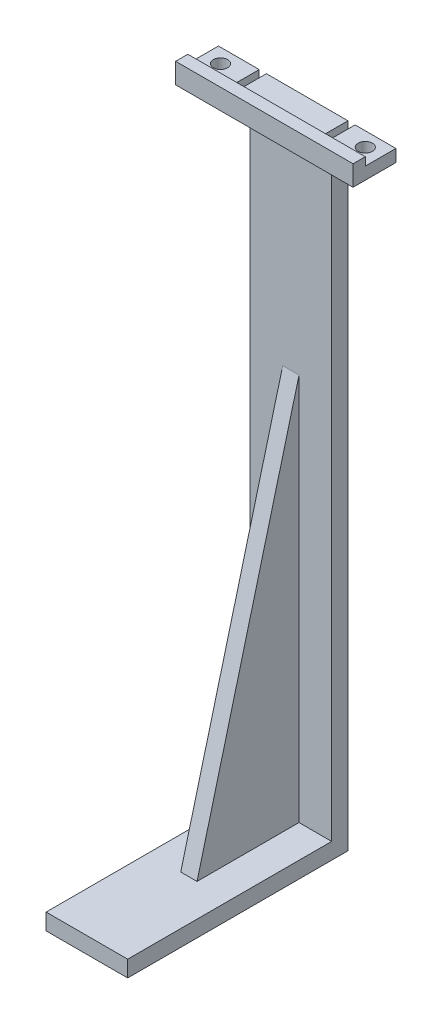
ISO-10303-21;
HEADER;
FILE_DESCRIPTION(('STEP AP214'),'2;1');
FILE_NAME('part.step','',(''),(''),'','','');
FILE_SCHEMA(('AUTOMOTIVE_DESIGN { 1 0 10303 214 1 1 1 1 }'));
ENDSEC;
DATA;
#1=APPLICATION_CONTEXT('core data for automotive mechanical design processes');
#2=APPLICATION_PROTOCOL_DEFINITION('international standard','automotive_design',2000,#1);
#3=PRODUCT_CONTEXT('',#1,'mechanical');
#4=PRODUCT('Part','Part','',(#3));
#5=PRODUCT_RELATED_PRODUCT_CATEGORY('part','',(#4));
#6=PRODUCT_DEFINITION_FORMATION('','',#4);
#7=PRODUCT_DEFINITION_CONTEXT('part definition',#1,'design');
#8=PRODUCT_DEFINITION('design','',#6,#7);
#9=PRODUCT_DEFINITION_SHAPE('','',#8);
#10=(LENGTH_UNIT() NAMED_UNIT(*) SI_UNIT(.MILLI.,.METRE.));
#11=(NAMED_UNIT(*) PLANE_ANGLE_UNIT() SI_UNIT($,.RADIAN.));
#12=(NAMED_UNIT(*) SI_UNIT($,.STERADIAN.) SOLID_ANGLE_UNIT());
#13=UNCERTAINTY_MEASURE_WITH_UNIT(LENGTH_MEASURE(1.E-05),#10,'distance_accuracy_value','');
#14=(GEOMETRIC_REPRESENTATION_CONTEXT(3) GLOBAL_UNCERTAINTY_ASSIGNED_CONTEXT((#13)) GLOBAL_UNIT_ASSIGNED_CONTEXT((#10,
#11,#12)) REPRESENTATION_CONTEXT('',''));
#15=CARTESIAN_POINT('',(0.,0.,0.));
#16=DIRECTION('',(0.,0.,1.));
#17=DIRECTION('',(1.,0.,0.));
#18=AXIS2_PLACEMENT_3D('',#15,#16,#17);
#19=CARTESIAN_POINT('',(0.,0.,7.5));
#20=DIRECTION('',(0.,0.,1.));
#21=DIRECTION('',(1.,0.,0.));
#22=AXIS2_PLACEMENT_3D('',#19,#20,#21);
#23=PLANE('',#22);
#24=DIRECTION('',(0.,1.,0.));
#25=VECTOR('',#24,1.);
#26=CARTESIAN_POINT('',(11.75,74.5,7.5));
#27=LINE('',#26,#25);
#28=CARTESIAN_POINT('',(11.75,74.5,7.5));
#29=VERTEX_POINT('',#28);
#30=CARTESIAN_POINT('',(11.75,77.5,7.5));
#31=VERTEX_POINT('',#30);
#32=EDGE_CURVE('E202',#29,#31,#27,.T.);
#33=ORIENTED_EDGE('',*,*,#32,.F.);
#34=DIRECTION('',(1.,0.,0.));
#35=VECTOR('',#34,1.);
#36=CARTESIAN_POINT('',(0.,74.5,7.5));
#37=LINE('',#36,#35);
#38=CARTESIAN_POINT('',(9.99999999999999,74.5,7.5));
#39=VERTEX_POINT('',#38);
#40=EDGE_CURVE('E251',#39,#29,#37,.T.);
#41=ORIENTED_EDGE('',*,*,#40,.F.);
#42=DIRECTION('',(0.,1.,0.));
#43=VECTOR('',#42,1.);
#44=CARTESIAN_POINT('',(9.99999999999999,77.5,7.5));
#45=LINE('',#44,#43);
#46=CARTESIAN_POINT('',(9.99999999999999,77.5,7.5));
#47=VERTEX_POINT('',#46);
#48=EDGE_CURVE('E262',#39,#47,#45,.T.);
#49=ORIENTED_EDGE('',*,*,#48,.T.);
#50=DIRECTION('',(-1.,0.,0.));
#51=VECTOR('',#50,1.);
#52=CARTESIAN_POINT('',(9.99999999999999,77.5,7.5));
#53=LINE('',#52,#51);
#54=CARTESIAN_POINT('',(-10.,77.5,7.5));
#55=VERTEX_POINT('',#54);
#56=EDGE_CURVE('E265',#47,#55,#53,.T.);
#57=ORIENTED_EDGE('',*,*,#56,.T.);
#58=DIRECTION('',(0.,-1.,0.));
#59=VECTOR('',#58,1.);
#60=CARTESIAN_POINT('',(-10.,77.5,7.5));
#61=LINE('',#60,#59);
#62=CARTESIAN_POINT('',(-10.,74.5,7.5));
#63=VERTEX_POINT('',#62);
#64=EDGE_CURVE('E268',#55,#63,#61,.T.);
#65=ORIENTED_EDGE('',*,*,#64,.T.);
#66=CARTESIAN_POINT('',(-11.75,74.5,7.5));
#67=VERTEX_POINT('',#66);
#68=EDGE_CURVE('E252',#67,#63,#37,.T.);
#69=ORIENTED_EDGE('',*,*,#68,.F.);
#70=DIRECTION('',(0.,-1.,0.));
#71=VECTOR('',#70,1.);
#72=CARTESIAN_POINT('',(-11.75,74.5,7.5));
#73=LINE('',#72,#71);
#74=CARTESIAN_POINT('',(-11.75,77.5,7.5));
#75=VERTEX_POINT('',#74);
#76=EDGE_CURVE('E221',#75,#67,#73,.T.);
#77=ORIENTED_EDGE('',*,*,#76,.F.);
#78=DIRECTION('',(1.,0.,0.));
#79=VECTOR('',#78,1.);
#80=CARTESIAN_POINT('',(-21.75,77.5,7.5));
#81=LINE('',#80,#79);
#82=CARTESIAN_POINT('',(-21.75,77.5,7.5));
#83=VERTEX_POINT('',#82);
#84=EDGE_CURVE('E216',#83,#75,#81,.T.);
#85=ORIENTED_EDGE('',*,*,#84,.F.);
#86=DIRECTION('',(0.,-1.,0.));
#87=VECTOR('',#86,1.);
#88=CARTESIAN_POINT('',(-21.75,79.5,7.5));
#89=LINE('',#88,#87);
#90=CARTESIAN_POINT('',(-21.75,79.5,7.5));
#91=VERTEX_POINT('',#90);
#92=EDGE_CURVE('E238',#91,#83,#89,.T.);
#93=ORIENTED_EDGE('',*,*,#92,.F.);
#94=DIRECTION('',(-1.,0.,0.));
#95=VECTOR('',#94,1.);
#96=CARTESIAN_POINT('',(-21.75,79.5,7.5));
#97=LINE('',#96,#95);
#98=CARTESIAN_POINT('',(21.75,79.5,7.5));
#99=VERTEX_POINT('',#98);
#100=EDGE_CURVE('E243',#99,#91,#97,.T.);
#101=ORIENTED_EDGE('',*,*,#100,.F.);
#102=DIRECTION('',(0.,1.,0.));
#103=VECTOR('',#102,1.);
#104=CARTESIAN_POINT('',(21.75,79.5,7.5));
#105=LINE('',#104,#103);
#106=CARTESIAN_POINT('',(21.75,77.5,7.5));
#107=VERTEX_POINT('',#106);
#108=EDGE_CURVE('E254',#107,#99,#105,.T.);
#109=ORIENTED_EDGE('',*,*,#108,.F.);
#110=DIRECTION('',(1.,0.,0.));
#111=VECTOR('',#110,1.);
#112=CARTESIAN_POINT('',(21.75,77.5,7.5));
#113=LINE('',#112,#111);
#114=EDGE_CURVE('E200',#31,#107,#113,.T.);
#115=ORIENTED_EDGE('',*,*,#114,.F.);
#116=EDGE_LOOP('',(#33,#41,#49,#57,#65,#69,#77,#85,#93,#101,#109,#115));
#117=FACE_BOUND('',#116,.T.);
#118=ADVANCED_FACE('F35',(#117),#23,.F.);
#119=CARTESIAN_POINT('',(0.,0.,4.));
#120=DIRECTION('',(0.,0.,-1.));
#121=DIRECTION('',(-1.,0.,0.));
#122=AXIS2_PLACEMENT_3D('',#119,#120,#121);
#123=PLANE('',#122);
#124=DIRECTION('',(1.,0.,0.));
#125=VECTOR('',#124,1.);
#126=CARTESIAN_POINT('',(9.99999999999999,74.5,4.));
#127=LINE('',#126,#125);
#128=CARTESIAN_POINT('',(-10.,74.5,4.));
#129=VERTEX_POINT('',#128);
#130=CARTESIAN_POINT('',(9.99999999999999,74.5,4.));
#131=VERTEX_POINT('',#130);
#132=EDGE_CURVE('E58',#129,#131,#127,.T.);
#133=ORIENTED_EDGE('',*,*,#132,.F.);
#134=DIRECTION('',(0.,-1.,0.));
#135=VECTOR('',#134,1.);
#136=CARTESIAN_POINT('',(-10.,77.5,4.));
#137=LINE('',#136,#135);
#138=CARTESIAN_POINT('',(-9.99999999999999,-73.5,4.));
#139=VERTEX_POINT('',#138);
#140=EDGE_CURVE('E314',#129,#139,#137,.T.);
#141=ORIENTED_EDGE('',*,*,#140,.T.);
#142=DIRECTION('',(1.,0.,0.));
#143=VECTOR('',#142,1.);
#144=CARTESIAN_POINT('',(-9.99999999999999,-73.5,4.));
#145=LINE('',#144,#143);
#146=CARTESIAN_POINT('',(-2.,-73.5,4.));
#147=VERTEX_POINT('',#146);
#148=EDGE_CURVE('E297',#139,#147,#145,.T.);
#149=ORIENTED_EDGE('',*,*,#148,.T.);
#150=DIRECTION('',(0.,-1.,0.));
#151=VECTOR('',#150,1.);
#152=CARTESIAN_POINT('',(-2.,0.,4.));
#153=LINE('',#152,#151);
#154=CARTESIAN_POINT('',(-2.,21.5000000000001,3.99999999999999));
#155=VERTEX_POINT('',#154);
#156=EDGE_CURVE('E282',#155,#147,#153,.T.);
#157=ORIENTED_EDGE('',*,*,#156,.F.);
#158=DIRECTION('',(-1.,0.,0.));
#159=VECTOR('',#158,1.);
#160=CARTESIAN_POINT('',(0.,21.5,4.));
#161=LINE('',#160,#159);
#162=CARTESIAN_POINT('',(2.,21.5000000000001,3.99999999999999));
#163=VERTEX_POINT('',#162);
#164=EDGE_CURVE('E289',#155,#163,#161,.F.);
#165=ORIENTED_EDGE('',*,*,#164,.T.);
#166=DIRECTION('',(0.,-1.,0.));
#167=VECTOR('',#166,1.);
#168=CARTESIAN_POINT('',(2.,0.,4.));
#169=LINE('',#168,#167);
#170=CARTESIAN_POINT('',(2.,-73.5,4.));
#171=VERTEX_POINT('',#170);
#172=EDGE_CURVE('E286',#163,#171,#169,.T.);
#173=ORIENTED_EDGE('',*,*,#172,.T.);
#174=CARTESIAN_POINT('',(10.,-73.5,4.));
#175=VERTEX_POINT('',#174);
#176=EDGE_CURVE('E292',#171,#175,#145,.T.);
#177=ORIENTED_EDGE('',*,*,#176,.T.);
#178=DIRECTION('',(0.,1.,0.));
#179=VECTOR('',#178,1.);
#180=CARTESIAN_POINT('',(9.99999999999999,77.5,4.));
#181=LINE('',#180,#179);
#182=EDGE_CURVE('E316',#175,#131,#181,.T.);
#183=ORIENTED_EDGE('',*,*,#182,.T.);
#184=EDGE_LOOP('',(#133,#141,#149,#157,#165,#173,#177,#183));
#185=FACE_BOUND('',#184,.T.);
#186=ADVANCED_FACE('F353',(#185),#123,.F.);
#187=CARTESIAN_POINT('',(-10.,77.5,4.));
#188=DIRECTION('',(1.,0.,0.));
#189=DIRECTION('',(0.,1.,0.));
#190=AXIS2_PLACEMENT_3D('',#187,#188,#189);
#191=PLANE('',#190);
#192=DIRECTION('',(0.,-1.,0.));
#193=VECTOR('',#192,1.);
#194=CARTESIAN_POINT('',(-10.,77.5,0.));
#195=LINE('',#194,#193);
#196=CARTESIAN_POINT('',(-10.,77.5,0.));
#197=VERTEX_POINT('',#196);
#198=CARTESIAN_POINT('',(-9.99999999999999,-77.5,0.));
#199=VERTEX_POINT('',#198);
#200=EDGE_CURVE('E311',#197,#199,#195,.T.);
#201=ORIENTED_EDGE('',*,*,#200,.T.);
#202=DIRECTION('',(0.,0.,-1.));
#203=VECTOR('',#202,1.);
#204=CARTESIAN_POINT('',(-9.99999999999999,-77.5,4.));
#205=LINE('',#204,#203);
#206=CARTESIAN_POINT('',(-9.99999999999999,-77.5,54.));
#207=VERTEX_POINT('',#206);
#208=EDGE_CURVE('E335',#207,#199,#205,.T.);
#209=ORIENTED_EDGE('',*,*,#208,.F.);
#210=DIRECTION('',(0.,1.,0.));
#211=VECTOR('',#210,1.);
#212=CARTESIAN_POINT('',(-9.99999999999999,-77.5,54.));
#213=LINE('',#212,#211);
#214=CARTESIAN_POINT('',(-9.99999999999999,-73.5,54.));
#215=VERTEX_POINT('',#214);
#216=EDGE_CURVE('E293',#207,#215,#213,.T.);
#217=ORIENTED_EDGE('',*,*,#216,.T.);
#218=DIRECTION('',(0.,0.,-1.));
#219=VECTOR('',#218,1.);
#220=CARTESIAN_POINT('',(-9.99999999999999,-73.5,54.));
#221=LINE('',#220,#219);
#222=EDGE_CURVE('E305',#215,#139,#221,.T.);
#223=ORIENTED_EDGE('',*,*,#222,.T.);
#224=ORIENTED_EDGE('',*,*,#140,.F.);
#225=DIRECTION('',(0.,0.,-1.));
#226=VECTOR('',#225,1.);
#227=CARTESIAN_POINT('',(-10.,74.5,7.5));
#228=LINE('',#227,#226);
#229=EDGE_CURVE('E275',#63,#129,#228,.T.);
#230=ORIENTED_EDGE('',*,*,#229,.F.);
#231=ORIENTED_EDGE('',*,*,#64,.F.);
#232=DIRECTION('',(0.,0.,-1.));
#233=VECTOR('',#232,1.);
#234=CARTESIAN_POINT('',(-10.,77.5,4.));
#235=LINE('',#234,#233);
#236=EDGE_CURVE('E319',#55,#197,#235,.T.);
#237=ORIENTED_EDGE('',*,*,#236,.T.);
#238=EDGE_LOOP('',(#201,#209,#217,#223,#224,#230,#231,#237));
#239=FACE_BOUND('',#238,.T.);
#240=ADVANCED_FACE('F37',(#239),#191,.F.);
#241=CARTESIAN_POINT('',(10.,-77.5,4.));
#242=DIRECTION('',(0.,1.,0.));
#243=DIRECTION('',(0.,0.,1.));
#244=AXIS2_PLACEMENT_3D('',#241,#242,#243);
#245=PLANE('',#244);
#246=DIRECTION('',(1.,0.,0.));
#247=VECTOR('',#246,1.);
#248=CARTESIAN_POINT('',(10.,-77.5,0.));
#249=LINE('',#248,#247);
#250=CARTESIAN_POINT('',(10.,-77.5,0.));
#251=VERTEX_POINT('',#250);
#252=EDGE_CURVE('E322',#199,#251,#249,.T.);
#253=ORIENTED_EDGE('',*,*,#252,.T.);
#254=DIRECTION('',(0.,0.,-1.));
#255=VECTOR('',#254,1.);
#256=CARTESIAN_POINT('',(10.,-77.5,4.));
#257=LINE('',#256,#255);
#258=CARTESIAN_POINT('',(10.,-77.5,54.));
#259=VERTEX_POINT('',#258);
#260=EDGE_CURVE('E332',#259,#251,#257,.T.);
#261=ORIENTED_EDGE('',*,*,#260,.F.);
#262=DIRECTION('',(1.,0.,0.));
#263=VECTOR('',#262,1.);
#264=CARTESIAN_POINT('',(-9.99999999999999,-77.5,54.));
#265=LINE('',#264,#263);
#266=EDGE_CURVE('E302',#207,#259,#265,.T.);
#267=ORIENTED_EDGE('',*,*,#266,.F.);
#268=ORIENTED_EDGE('',*,*,#208,.T.);
#269=EDGE_LOOP('',(#253,#261,#267,#268));
#270=FACE_BOUND('',#269,.T.);
#271=ADVANCED_FACE('F416',(#270),#245,.F.);
#272=CARTESIAN_POINT('',(9.99999999999999,77.5,4.));
#273=DIRECTION('',(-1.,0.,0.));
#274=DIRECTION('',(0.,-1.,0.));
#275=AXIS2_PLACEMENT_3D('',#272,#273,#274);
#276=PLANE('',#275);
#277=DIRECTION('',(0.,1.,0.));
#278=VECTOR('',#277,1.);
#279=CARTESIAN_POINT('',(9.99999999999999,77.5,0.));
#280=LINE('',#279,#278);
#281=CARTESIAN_POINT('',(9.99999999999999,77.5,0.));
#282=VERTEX_POINT('',#281);
#283=EDGE_CURVE('E324',#251,#282,#280,.T.);
#284=ORIENTED_EDGE('',*,*,#283,.T.);
#285=DIRECTION('',(0.,0.,-1.));
#286=VECTOR('',#285,1.);
#287=CARTESIAN_POINT('',(9.99999999999999,77.5,4.));
#288=LINE('',#287,#286);
#289=EDGE_CURVE('E329',#47,#282,#288,.T.);
#290=ORIENTED_EDGE('',*,*,#289,.F.);
#291=ORIENTED_EDGE('',*,*,#48,.F.);
#292=DIRECTION('',(0.,0.,-1.));
#293=VECTOR('',#292,1.);
#294=CARTESIAN_POINT('',(9.99999999999999,74.5,7.5));
#295=LINE('',#294,#293);
#296=EDGE_CURVE('E271',#39,#131,#295,.T.);
#297=ORIENTED_EDGE('',*,*,#296,.T.);
#298=ORIENTED_EDGE('',*,*,#182,.F.);
#299=DIRECTION('',(0.,0.,-1.));
#300=VECTOR('',#299,1.);
#301=CARTESIAN_POINT('',(10.,-73.5,54.));
#302=LINE('',#301,#300);
#303=CARTESIAN_POINT('',(10.,-73.5,54.));
#304=VERTEX_POINT('',#303);
#305=EDGE_CURVE('E308',#304,#175,#302,.T.);
#306=ORIENTED_EDGE('',*,*,#305,.F.);
#307=DIRECTION('',(0.,1.,0.));
#308=VECTOR('',#307,1.);
#309=CARTESIAN_POINT('',(10.,-77.5,54.));
#310=LINE('',#309,#308);
#311=EDGE_CURVE('E300',#259,#304,#310,.T.);
#312=ORIENTED_EDGE('',*,*,#311,.F.);
#313=ORIENTED_EDGE('',*,*,#260,.T.);
#314=EDGE_LOOP('',(#284,#290,#291,#297,#298,#306,#312,#313));
#315=FACE_BOUND('',#314,.T.);
#316=ADVANCED_FACE('F367',(#315),#276,.F.);
#317=CARTESIAN_POINT('',(9.99999999999999,77.5,4.));
#318=DIRECTION('',(0.,-1.,0.));
#319=DIRECTION('',(0.,0.,-1.));
#320=AXIS2_PLACEMENT_3D('',#317,#318,#319);
#321=PLANE('',#320);
#322=DIRECTION('',(-1.,0.,0.));
#323=VECTOR('',#322,1.);
#324=CARTESIAN_POINT('',(9.99999999999999,77.5,0.));
#325=LINE('',#324,#323);
#326=EDGE_CURVE('E317',#282,#197,#325,.T.);
#327=ORIENTED_EDGE('',*,*,#326,.T.);
#328=ORIENTED_EDGE('',*,*,#236,.F.);
#329=ORIENTED_EDGE('',*,*,#56,.F.);
#330=ORIENTED_EDGE('',*,*,#289,.T.);
#331=EDGE_LOOP('',(#327,#328,#329,#330));
#332=FACE_BOUND('',#331,.T.);
#333=ADVANCED_FACE('F409',(#332),#321,.F.);
#334=CARTESIAN_POINT('',(0.,0.,0.));
#335=DIRECTION('',(0.,0.,-1.));
#336=DIRECTION('',(-1.,0.,0.));
#337=AXIS2_PLACEMENT_3D('',#334,#335,#336);
#338=PLANE('',#337);
#339=ORIENTED_EDGE('',*,*,#283,.F.);
#340=ORIENTED_EDGE('',*,*,#252,.F.);
#341=ORIENTED_EDGE('',*,*,#200,.F.);
#342=ORIENTED_EDGE('',*,*,#326,.F.);
#343=EDGE_LOOP('',(#339,#340,#341,#342));
#344=FACE_BOUND('',#343,.T.);
#345=ADVANCED_FACE('F414',(#344),#338,.T.);
#346=CARTESIAN_POINT('',(-9.99999999999999,-73.5,54.));
#347=DIRECTION('',(0.,1.,0.));
#348=DIRECTION('',(0.,0.,1.));
#349=AXIS2_PLACEMENT_3D('',#346,#347,#348);
#350=PLANE('',#349);
#351=DIRECTION('',(0.,0.,-1.));
#352=VECTOR('',#351,1.);
#353=CARTESIAN_POINT('',(2.,-73.5,54.));
#354=LINE('',#353,#352);
#355=CARTESIAN_POINT('',(2.,-73.5,29.));
#356=VERTEX_POINT('',#355);
#357=EDGE_CURVE('E11',#356,#171,#354,.T.);
#358=ORIENTED_EDGE('',*,*,#357,.F.);
#359=DIRECTION('',(-1.,0.,0.));
#360=VECTOR('',#359,1.);
#361=CARTESIAN_POINT('',(-9.99999999999999,-73.5,29.));
#362=LINE('',#361,#360);
#363=CARTESIAN_POINT('',(-2.,-73.5,29.));
#364=VERTEX_POINT('',#363);
#365=EDGE_CURVE('E43',#364,#356,#362,.F.);
#366=ORIENTED_EDGE('',*,*,#365,.F.);
#367=DIRECTION('',(0.,0.,-1.));
#368=VECTOR('',#367,1.);
#369=CARTESIAN_POINT('',(-2.,-73.5,54.));
#370=LINE('',#369,#368);
#371=EDGE_CURVE('E338',#364,#147,#370,.T.);
#372=ORIENTED_EDGE('',*,*,#371,.T.);
#373=ORIENTED_EDGE('',*,*,#148,.F.);
#374=ORIENTED_EDGE('',*,*,#222,.F.);
#375=DIRECTION('',(1.,0.,0.));
#376=VECTOR('',#375,1.);
#377=CARTESIAN_POINT('',(-9.99999999999999,-73.5,54.));
#378=LINE('',#377,#376);
#379=EDGE_CURVE('E296',#215,#304,#378,.T.);
#380=ORIENTED_EDGE('',*,*,#379,.T.);
#381=ORIENTED_EDGE('',*,*,#305,.T.);
#382=ORIENTED_EDGE('',*,*,#176,.F.);
#383=EDGE_LOOP('',(#358,#366,#372,#373,#374,#380,#381,#382));
#384=FACE_BOUND('',#383,.T.);
#385=ADVANCED_FACE('F350',(#384),#350,.T.);
#386=CARTESIAN_POINT('',(0.,0.,54.));
#387=DIRECTION('',(0.,0.,-1.));
#388=DIRECTION('',(-1.,0.,0.));
#389=AXIS2_PLACEMENT_3D('',#386,#387,#388);
#390=PLANE('',#389);
#391=ORIENTED_EDGE('',*,*,#216,.F.);
#392=ORIENTED_EDGE('',*,*,#266,.T.);
#393=ORIENTED_EDGE('',*,*,#311,.T.);
#394=ORIENTED_EDGE('',*,*,#379,.F.);
#395=EDGE_LOOP('',(#391,#392,#393,#394));
#396=FACE_BOUND('',#395,.T.);
#397=ADVANCED_FACE('F363',(#396),#390,.F.);
#398=CARTESIAN_POINT('',(0.,-73.5,29.));
#399=DIRECTION('',(0.,-0.254493299279644,-0.967074537262647));
#400=DIRECTION('',(0.,0.967074537262646,-0.254493299279644));
#401=AXIS2_PLACEMENT_3D('',#398,#399,#400);
#402=PLANE('',#401);
#403=ORIENTED_EDGE('',*,*,#164,.F.);
#404=DIRECTION('',(0.,0.967074537262646,-0.254493299279644));
#405=VECTOR('',#404,1.);
#406=CARTESIAN_POINT('',(-2.,-73.5,29.));
#407=LINE('',#406,#405);
#408=EDGE_CURVE('E278',#364,#155,#407,.T.);
#409=ORIENTED_EDGE('',*,*,#408,.F.);
#410=ORIENTED_EDGE('',*,*,#365,.T.);
#411=DIRECTION('',(0.,0.967074537262646,-0.254493299279644));
#412=VECTOR('',#411,1.);
#413=CARTESIAN_POINT('',(2.,-73.5,29.));
#414=LINE('',#413,#412);
#415=EDGE_CURVE('E279',#356,#163,#414,.T.);
#416=ORIENTED_EDGE('',*,*,#415,.T.);
#417=EDGE_LOOP('',(#403,#409,#410,#416));
#418=FACE_BOUND('',#417,.T.);
#419=ADVANCED_FACE('F344',(#418),#402,.F.);
#420=CARTESIAN_POINT('',(2.,0.,27.));
#421=DIRECTION('',(1.,0.,0.));
#422=DIRECTION('',(0.,0.,-1.));
#423=AXIS2_PLACEMENT_3D('',#420,#421,#422);
#424=PLANE('',#423);
#425=ORIENTED_EDGE('',*,*,#172,.F.);
#426=ORIENTED_EDGE('',*,*,#415,.F.);
#427=ORIENTED_EDGE('',*,*,#357,.T.);
#428=EDGE_LOOP('',(#425,#426,#427));
#429=FACE_BOUND('',#428,.T.);
#430=ADVANCED_FACE('F348',(#429),#424,.T.);
#431=CARTESIAN_POINT('',(-2.,0.,27.));
#432=DIRECTION('',(1.,0.,0.));
#433=DIRECTION('',(0.,0.,-1.));
#434=AXIS2_PLACEMENT_3D('',#431,#432,#433);
#435=PLANE('',#434);
#436=ORIENTED_EDGE('',*,*,#408,.T.);
#437=ORIENTED_EDGE('',*,*,#156,.T.);
#438=ORIENTED_EDGE('',*,*,#371,.F.);
#439=EDGE_LOOP('',(#436,#437,#438));
#440=FACE_BOUND('',#439,.T.);
#441=ADVANCED_FACE('F356',(#440),#435,.F.);
#442=CARTESIAN_POINT('',(9.99999999999999,74.5,7.5));
#443=DIRECTION('',(0.,1.,0.));
#444=DIRECTION('',(0.,0.,1.));
#445=AXIS2_PLACEMENT_3D('',#442,#443,#444);
#446=PLANE('',#445);
#447=CARTESIAN_POINT('',(-17.75,74.5,3.5));
#448=DIRECTION('',(0.,1.,0.));
#449=DIRECTION('',(0.,0.,1.));
#450=AXIS2_PLACEMENT_3D('',#447,#448,#449);
#451=CIRCLE('',#450,1.75);
#452=CARTESIAN_POINT('',(-17.75,74.5,5.25));
#453=VERTEX_POINT('',#452);
#454=EDGE_CURVE('E205',#453,#453,#451,.T.);
#455=ORIENTED_EDGE('',*,*,#454,.T.);
#456=EDGE_LOOP('',(#455));
#457=FACE_BOUND('',#456,.T.);
#458=CARTESIAN_POINT('',(17.75,74.5,3.5));
#459=DIRECTION('',(0.,1.,0.));
#460=DIRECTION('',(0.,0.,1.));
#461=AXIS2_PLACEMENT_3D('',#458,#459,#460);
#462=CIRCLE('',#461,1.75000000000001);
#463=CARTESIAN_POINT('',(17.75,74.5,5.25000000000001));
#464=VERTEX_POINT('',#463);
#465=EDGE_CURVE('E664',#464,#464,#462,.T.);
#466=ORIENTED_EDGE('',*,*,#465,.T.);
#467=EDGE_LOOP('',(#466));
#468=FACE_BOUND('',#467,.T.);
#469=ORIENTED_EDGE('',*,*,#132,.T.);
#470=ORIENTED_EDGE('',*,*,#296,.F.);
#471=ORIENTED_EDGE('',*,*,#40,.T.);
#472=DIRECTION('',(0.,0.,1.));
#473=VECTOR('',#472,1.);
#474=CARTESIAN_POINT('',(11.75,74.5,0.));
#475=LINE('',#474,#473);
#476=CARTESIAN_POINT('',(11.75,74.5,0.));
#477=VERTEX_POINT('',#476);
#478=EDGE_CURVE('E192',#477,#29,#475,.T.);
#479=ORIENTED_EDGE('',*,*,#478,.F.);
#480=DIRECTION('',(-1.,0.,0.));
#481=VECTOR('',#480,1.);
#482=CARTESIAN_POINT('',(21.75,74.5,0.));
#483=LINE('',#482,#481);
#484=CARTESIAN_POINT('',(21.75,74.5,0.));
#485=VERTEX_POINT('',#484);
#486=EDGE_CURVE('E189',#485,#477,#483,.T.);
#487=ORIENTED_EDGE('',*,*,#486,.F.);
#488=DIRECTION('',(0.,0.,-1.));
#489=VECTOR('',#488,1.);
#490=CARTESIAN_POINT('',(21.75,74.5,10.5));
#491=LINE('',#490,#489);
#492=CARTESIAN_POINT('',(21.75,74.5,10.5));
#493=VERTEX_POINT('',#492);
#494=EDGE_CURVE('E177',#493,#485,#491,.T.);
#495=ORIENTED_EDGE('',*,*,#494,.F.);
#496=DIRECTION('',(1.,0.,0.));
#497=VECTOR('',#496,1.);
#498=CARTESIAN_POINT('',(-21.75,74.5,10.5));
#499=LINE('',#498,#497);
#500=CARTESIAN_POINT('',(-21.75,74.5,10.5));
#501=VERTEX_POINT('',#500);
#502=EDGE_CURVE('E242',#501,#493,#499,.T.);
#503=ORIENTED_EDGE('',*,*,#502,.F.);
#504=DIRECTION('',(0.,0.,-1.));
#505=VECTOR('',#504,1.);
#506=CARTESIAN_POINT('',(-21.75,74.5,10.5));
#507=LINE('',#506,#505);
#508=CARTESIAN_POINT('',(-21.75,74.5,0.));
#509=VERTEX_POINT('',#508);
#510=EDGE_CURVE('E185',#501,#509,#507,.T.);
#511=ORIENTED_EDGE('',*,*,#510,.T.);
#512=DIRECTION('',(-1.,0.,0.));
#513=VECTOR('',#512,1.);
#514=CARTESIAN_POINT('',(-21.75,74.5,0.));
#515=LINE('',#514,#513);
#516=CARTESIAN_POINT('',(-11.75,74.5,0.));
#517=VERTEX_POINT('',#516);
#518=EDGE_CURVE('E225',#517,#509,#515,.T.);
#519=ORIENTED_EDGE('',*,*,#518,.F.);
#520=DIRECTION('',(0.,0.,1.));
#521=VECTOR('',#520,1.);
#522=CARTESIAN_POINT('',(-11.75,74.5,0.));
#523=LINE('',#522,#521);
#524=EDGE_CURVE('E228',#517,#67,#523,.T.);
#525=ORIENTED_EDGE('',*,*,#524,.T.);
#526=ORIENTED_EDGE('',*,*,#68,.T.);
#527=ORIENTED_EDGE('',*,*,#229,.T.);
#528=EDGE_LOOP('',(#469,#470,#471,#479,#487,#495,#503,#511,#519,#525,#526,#527));
#529=FACE_BOUND('',#528,.T.);
#530=ADVANCED_FACE('F190',(#457,#468,#529),#446,.F.);
#531=CARTESIAN_POINT('',(-21.75,79.5,10.5));
#532=DIRECTION('',(1.,0.,0.));
#533=DIRECTION('',(0.,0.,-1.));
#534=AXIS2_PLACEMENT_3D('',#531,#532,#533);
#535=PLANE('',#534);
#536=ORIENTED_EDGE('',*,*,#92,.T.);
#537=DIRECTION('',(0.,0.,1.));
#538=VECTOR('',#537,1.);
#539=CARTESIAN_POINT('',(-21.75,77.5,0.));
#540=LINE('',#539,#538);
#541=CARTESIAN_POINT('',(-21.75,77.5,0.));
#542=VERTEX_POINT('',#541);
#543=EDGE_CURVE('E236',#542,#83,#540,.T.);
#544=ORIENTED_EDGE('',*,*,#543,.F.);
#545=DIRECTION('',(0.,1.,0.));
#546=VECTOR('',#545,1.);
#547=CARTESIAN_POINT('',(-21.75,74.5,0.));
#548=LINE('',#547,#546);
#549=EDGE_CURVE('E217',#509,#542,#548,.T.);
#550=ORIENTED_EDGE('',*,*,#549,.F.);
#551=ORIENTED_EDGE('',*,*,#510,.F.);
#552=DIRECTION('',(0.,-1.,0.));
#553=VECTOR('',#552,1.);
#554=CARTESIAN_POINT('',(-21.75,79.5,10.5));
#555=LINE('',#554,#553);
#556=CARTESIAN_POINT('',(-21.75,79.5,10.5));
#557=VERTEX_POINT('',#556);
#558=EDGE_CURVE('E239',#557,#501,#555,.T.);
#559=ORIENTED_EDGE('',*,*,#558,.F.);
#560=DIRECTION('',(0.,0.,-1.));
#561=VECTOR('',#560,1.);
#562=CARTESIAN_POINT('',(-21.75,79.5,10.5));
#563=LINE('',#562,#561);
#564=EDGE_CURVE('E248',#557,#91,#563,.T.);
#565=ORIENTED_EDGE('',*,*,#564,.T.);
#566=EDGE_LOOP('',(#536,#544,#550,#551,#559,#565));
#567=FACE_BOUND('',#566,.T.);
#568=ADVANCED_FACE('F397',(#567),#535,.F.);
#569=CARTESIAN_POINT('',(21.75,79.5,10.5));
#570=DIRECTION('',(-1.,0.,0.));
#571=DIRECTION('',(0.,0.,1.));
#572=AXIS2_PLACEMENT_3D('',#569,#570,#571);
#573=PLANE('',#572);
#574=ORIENTED_EDGE('',*,*,#494,.T.);
#575=DIRECTION('',(0.,-1.,0.));
#576=VECTOR('',#575,1.);
#577=CARTESIAN_POINT('',(21.75,74.5,0.));
#578=LINE('',#577,#576);
#579=CARTESIAN_POINT('',(21.75,77.5,0.));
#580=VERTEX_POINT('',#579);
#581=EDGE_CURVE('E181',#580,#485,#578,.T.);
#582=ORIENTED_EDGE('',*,*,#581,.F.);
#583=DIRECTION('',(0.,0.,1.));
#584=VECTOR('',#583,1.);
#585=CARTESIAN_POINT('',(21.75,77.5,0.));
#586=LINE('',#585,#584);
#587=EDGE_CURVE('E50',#580,#107,#586,.T.);
#588=ORIENTED_EDGE('',*,*,#587,.T.);
#589=ORIENTED_EDGE('',*,*,#108,.T.);
#590=DIRECTION('',(0.,0.,-1.));
#591=VECTOR('',#590,1.);
#592=CARTESIAN_POINT('',(21.75,79.5,10.5));
#593=LINE('',#592,#591);
#594=CARTESIAN_POINT('',(21.75,79.5,10.5));
#595=VERTEX_POINT('',#594);
#596=EDGE_CURVE('E186',#595,#99,#593,.T.);
#597=ORIENTED_EDGE('',*,*,#596,.F.);
#598=DIRECTION('',(0.,1.,0.));
#599=VECTOR('',#598,1.);
#600=CARTESIAN_POINT('',(21.75,79.5,10.5));
#601=LINE('',#600,#599);
#602=EDGE_CURVE('E183',#493,#595,#601,.T.);
#603=ORIENTED_EDGE('',*,*,#602,.F.);
#604=EDGE_LOOP('',(#574,#582,#588,#589,#597,#603));
#605=FACE_BOUND('',#604,.T.);
#606=ADVANCED_FACE('F179',(#605),#573,.F.);
#607=CARTESIAN_POINT('',(-21.75,79.5,10.5));
#608=DIRECTION('',(0.,-1.,0.));
#609=DIRECTION('',(1.,0.,0.));
#610=AXIS2_PLACEMENT_3D('',#607,#608,#609);
#611=PLANE('',#610);
#612=ORIENTED_EDGE('',*,*,#100,.T.);
#613=ORIENTED_EDGE('',*,*,#564,.F.);
#614=DIRECTION('',(-1.,0.,0.));
#615=VECTOR('',#614,1.);
#616=CARTESIAN_POINT('',(-21.75,79.5,10.5));
#617=LINE('',#616,#615);
#618=EDGE_CURVE('E246',#595,#557,#617,.T.);
#619=ORIENTED_EDGE('',*,*,#618,.F.);
#620=ORIENTED_EDGE('',*,*,#596,.T.);
#621=EDGE_LOOP('',(#612,#613,#619,#620));
#622=FACE_BOUND('',#621,.T.);
#623=ADVANCED_FACE('F383',(#622),#611,.F.);
#624=CARTESIAN_POINT('',(0.,0.,10.5));
#625=DIRECTION('',(0.,0.,1.));
#626=DIRECTION('',(1.,0.,0.));
#627=AXIS2_PLACEMENT_3D('',#624,#625,#626);
#628=PLANE('',#627);
#629=ORIENTED_EDGE('',*,*,#558,.T.);
#630=ORIENTED_EDGE('',*,*,#502,.T.);
#631=ORIENTED_EDGE('',*,*,#602,.T.);
#632=ORIENTED_EDGE('',*,*,#618,.T.);
#633=EDGE_LOOP('',(#629,#630,#631,#632));
#634=FACE_BOUND('',#633,.T.);
#635=ADVANCED_FACE('F387',(#634),#628,.T.);
#636=CARTESIAN_POINT('',(-21.75,77.5,0.));
#637=DIRECTION('',(0.,-1.,0.));
#638=DIRECTION('',(0.,0.,-1.));
#639=AXIS2_PLACEMENT_3D('',#636,#637,#638);
#640=PLANE('',#639);
#641=CARTESIAN_POINT('',(-17.75,77.5,3.5));
#642=DIRECTION('',(0.,1.,0.));
#643=DIRECTION('',(0.,0.,1.));
#644=AXIS2_PLACEMENT_3D('',#641,#642,#643);
#645=CIRCLE('',#644,1.75);
#646=CARTESIAN_POINT('',(-17.75,77.5,5.25));
#647=VERTEX_POINT('',#646);
#648=EDGE_CURVE('E661',#647,#647,#645,.T.);
#649=ORIENTED_EDGE('',*,*,#648,.F.);
#650=EDGE_LOOP('',(#649));
#651=FACE_BOUND('',#650,.T.);
#652=ORIENTED_EDGE('',*,*,#84,.T.);
#653=DIRECTION('',(0.,0.,1.));
#654=VECTOR('',#653,1.);
#655=CARTESIAN_POINT('',(-11.75,77.5,0.));
#656=LINE('',#655,#654);
#657=CARTESIAN_POINT('',(-11.75,77.5,0.));
#658=VERTEX_POINT('',#657);
#659=EDGE_CURVE('E233',#658,#75,#656,.T.);
#660=ORIENTED_EDGE('',*,*,#659,.F.);
#661=DIRECTION('',(1.,0.,0.));
#662=VECTOR('',#661,1.);
#663=CARTESIAN_POINT('',(-21.75,77.5,0.));
#664=LINE('',#663,#662);
#665=EDGE_CURVE('E220',#542,#658,#664,.T.);
#666=ORIENTED_EDGE('',*,*,#665,.F.);
#667=ORIENTED_EDGE('',*,*,#543,.T.);
#668=EDGE_LOOP('',(#652,#660,#666,#667));
#669=FACE_BOUND('',#668,.T.);
#670=ADVANCED_FACE('F400',(#651,#669),#640,.F.);
#671=CARTESIAN_POINT('',(-11.75,74.5,0.));
#672=DIRECTION('',(-1.,0.,0.));
#673=DIRECTION('',(0.,0.,1.));
#674=AXIS2_PLACEMENT_3D('',#671,#672,#673);
#675=PLANE('',#674);
#676=ORIENTED_EDGE('',*,*,#76,.T.);
#677=ORIENTED_EDGE('',*,*,#524,.F.);
#678=DIRECTION('',(0.,-1.,0.));
#679=VECTOR('',#678,1.);
#680=CARTESIAN_POINT('',(-11.75,74.5,0.));
#681=LINE('',#680,#679);
#682=EDGE_CURVE('E223',#658,#517,#681,.T.);
#683=ORIENTED_EDGE('',*,*,#682,.F.);
#684=ORIENTED_EDGE('',*,*,#659,.T.);
#685=EDGE_LOOP('',(#676,#677,#683,#684));
#686=FACE_BOUND('',#685,.T.);
#687=ADVANCED_FACE('F405',(#686),#675,.F.);
#688=CARTESIAN_POINT('',(0.,0.,0.));
#689=DIRECTION('',(0.,0.,-1.));
#690=DIRECTION('',(-1.,0.,0.));
#691=AXIS2_PLACEMENT_3D('',#688,#689,#690);
#692=PLANE('',#691);
#693=ORIENTED_EDGE('',*,*,#549,.T.);
#694=ORIENTED_EDGE('',*,*,#665,.T.);
#695=ORIENTED_EDGE('',*,*,#682,.T.);
#696=ORIENTED_EDGE('',*,*,#518,.T.);
#697=EDGE_LOOP('',(#693,#694,#695,#696));
#698=FACE_BOUND('',#697,.T.);
#699=ADVANCED_FACE('F393',(#698),#692,.T.);
#700=CARTESIAN_POINT('',(11.75,74.5,0.));
#701=DIRECTION('',(1.,0.,0.));
#702=DIRECTION('',(0.,0.,-1.));
#703=AXIS2_PLACEMENT_3D('',#700,#701,#702);
#704=PLANE('',#703);
#705=ORIENTED_EDGE('',*,*,#32,.T.);
#706=DIRECTION('',(0.,0.,1.));
#707=VECTOR('',#706,1.);
#708=CARTESIAN_POINT('',(11.75,77.5,0.));
#709=LINE('',#708,#707);
#710=CARTESIAN_POINT('',(11.75,77.5,0.));
#711=VERTEX_POINT('',#710);
#712=EDGE_CURVE('E212',#711,#31,#709,.T.);
#713=ORIENTED_EDGE('',*,*,#712,.F.);
#714=DIRECTION('',(0.,1.,0.));
#715=VECTOR('',#714,1.);
#716=CARTESIAN_POINT('',(11.75,74.5,0.));
#717=LINE('',#716,#715);
#718=EDGE_CURVE('E195',#477,#711,#717,.T.);
#719=ORIENTED_EDGE('',*,*,#718,.F.);
#720=ORIENTED_EDGE('',*,*,#478,.T.);
#721=EDGE_LOOP('',(#705,#713,#719,#720));
#722=FACE_BOUND('',#721,.T.);
#723=ADVANCED_FACE('F376',(#722),#704,.F.);
#724=CARTESIAN_POINT('',(21.75,77.5,0.));
#725=DIRECTION('',(0.,-1.,0.));
#726=DIRECTION('',(0.,0.,-1.));
#727=AXIS2_PLACEMENT_3D('',#724,#725,#726);
#728=PLANE('',#727);
#729=CARTESIAN_POINT('',(17.75,77.5,3.5));
#730=DIRECTION('',(0.,1.,0.));
#731=DIRECTION('',(0.,0.,1.));
#732=AXIS2_PLACEMENT_3D('',#729,#730,#731);
#733=CIRCLE('',#732,1.75000000000001);
#734=CARTESIAN_POINT('',(17.75,77.5,5.25000000000001));
#735=VERTEX_POINT('',#734);
#736=EDGE_CURVE('E668',#735,#735,#733,.T.);
#737=ORIENTED_EDGE('',*,*,#736,.F.);
#738=EDGE_LOOP('',(#737));
#739=FACE_BOUND('',#738,.T.);
#740=ORIENTED_EDGE('',*,*,#114,.T.);
#741=ORIENTED_EDGE('',*,*,#587,.F.);
#742=DIRECTION('',(1.,0.,0.));
#743=VECTOR('',#742,1.);
#744=CARTESIAN_POINT('',(21.75,77.5,0.));
#745=LINE('',#744,#743);
#746=EDGE_CURVE('E199',#711,#580,#745,.T.);
#747=ORIENTED_EDGE('',*,*,#746,.F.);
#748=ORIENTED_EDGE('',*,*,#712,.T.);
#749=EDGE_LOOP('',(#740,#741,#747,#748));
#750=FACE_BOUND('',#749,.T.);
#751=ADVANCED_FACE('F378',(#739,#750),#728,.F.);
#752=CARTESIAN_POINT('',(0.,0.,0.));
#753=DIRECTION('',(0.,0.,1.));
#754=DIRECTION('',(1.,0.,0.));
#755=AXIS2_PLACEMENT_3D('',#752,#753,#754);
#756=PLANE('',#755);
#757=ORIENTED_EDGE('',*,*,#581,.T.);
#758=ORIENTED_EDGE('',*,*,#486,.T.);
#759=ORIENTED_EDGE('',*,*,#718,.T.);
#760=ORIENTED_EDGE('',*,*,#746,.T.);
#761=EDGE_LOOP('',(#757,#758,#759,#760));
#762=FACE_BOUND('',#761,.T.);
#763=ADVANCED_FACE('F197',(#762),#756,.F.);
#764=CARTESIAN_POINT('',(17.75,67.5,3.5));
#765=DIRECTION('',(0.,1.,0.));
#766=DIRECTION('',(0.,0.,1.));
#767=AXIS2_PLACEMENT_3D('',#764,#765,#766);
#768=CYLINDRICAL_SURFACE('',#767,1.75000000000001);
#769=ORIENTED_EDGE('',*,*,#736,.T.);
#770=EDGE_LOOP('',(#769));
#771=FACE_BOUND('',#770,.T.);
#772=ORIENTED_EDGE('',*,*,#465,.F.);
#773=EDGE_LOOP('',(#772));
#774=FACE_BOUND('',#773,.T.);
#775=ADVANCED_FACE('F542',(#771,#774),#768,.F.);
#776=CARTESIAN_POINT('',(-17.75,67.5,3.5));
#777=DIRECTION('',(0.,1.,0.));
#778=DIRECTION('',(0.,0.,1.));
#779=AXIS2_PLACEMENT_3D('',#776,#777,#778);
#780=CYLINDRICAL_SURFACE('',#779,1.75);
#781=ORIENTED_EDGE('',*,*,#648,.T.);
#782=EDGE_LOOP('',(#781));
#783=FACE_BOUND('',#782,.T.);
#784=ORIENTED_EDGE('',*,*,#454,.F.);
#785=EDGE_LOOP('',(#784));
#786=FACE_BOUND('',#785,.T.);
#787=ADVANCED_FACE('F548',(#783,#786),#780,.F.);
#788=CLOSED_SHELL('',(#118,#186,#240,#271,#316,#333,#345,#385,#397,#419,#430,#441,#530,#568,
#606,#623,#635,#670,#687,#699,#723,#751,#763,#775,#787));
#789=MANIFOLD_SOLID_BREP('B2',#788);
#790=ADVANCED_BREP_SHAPE_REPRESENTATION('',(#18,#789),#14);
#791=SHAPE_DEFINITION_REPRESENTATION(#9,#790);
ENDSEC;
END-ISO-10303-21;
